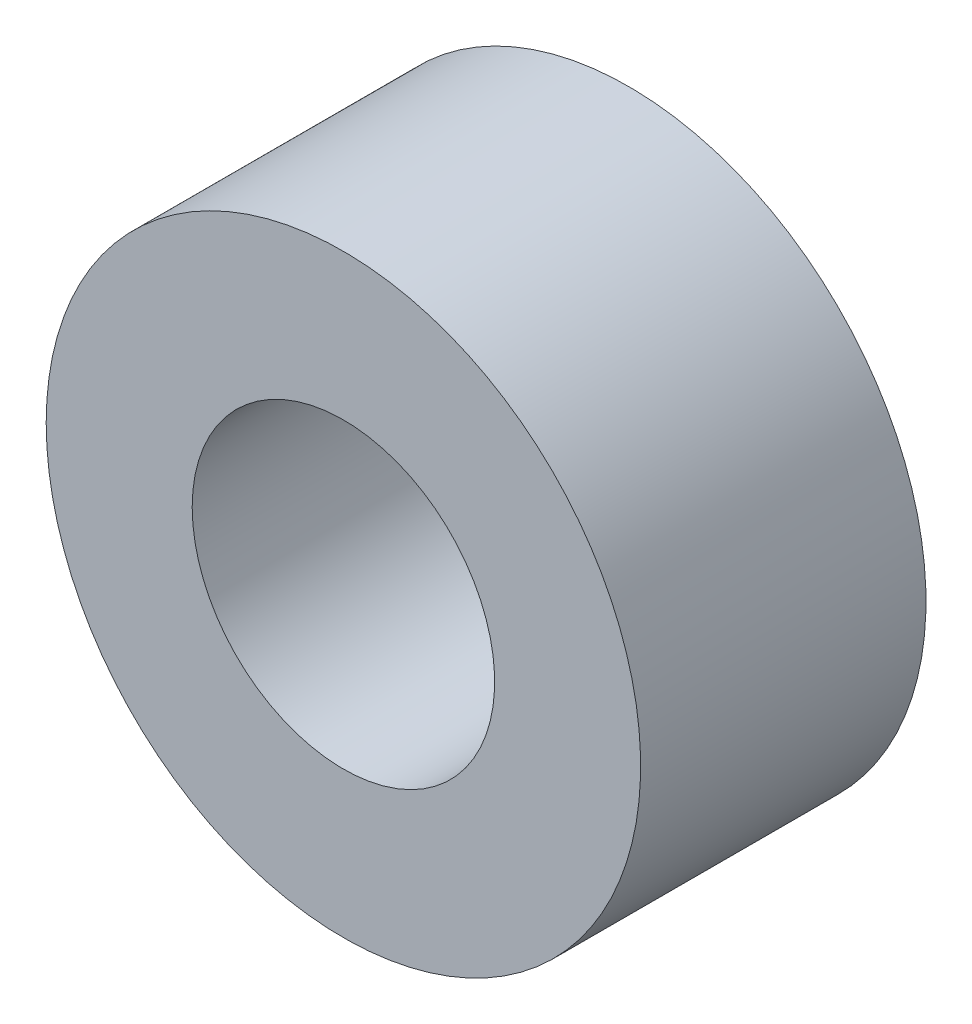
ISO-10303-21;
HEADER;
FILE_DESCRIPTION(('STEP AP214'),'2;1');
FILE_NAME('part.step','',(''),(''),'','','');
FILE_SCHEMA(('AUTOMOTIVE_DESIGN { 1 0 10303 214 1 1 1 1 }'));
ENDSEC;
DATA;
#1=APPLICATION_CONTEXT('core data for automotive mechanical design processes');
#2=APPLICATION_PROTOCOL_DEFINITION('international standard','automotive_design',2000,#1);
#3=PRODUCT_CONTEXT('',#1,'mechanical');
#4=PRODUCT('Part','Part','',(#3));
#5=PRODUCT_RELATED_PRODUCT_CATEGORY('part','',(#4));
#6=PRODUCT_DEFINITION_FORMATION('','',#4);
#7=PRODUCT_DEFINITION_CONTEXT('part definition',#1,'design');
#8=PRODUCT_DEFINITION('design','',#6,#7);
#9=PRODUCT_DEFINITION_SHAPE('','',#8);
#10=(LENGTH_UNIT() NAMED_UNIT(*) SI_UNIT(.MILLI.,.METRE.));
#11=(NAMED_UNIT(*) PLANE_ANGLE_UNIT() SI_UNIT($,.RADIAN.));
#12=(NAMED_UNIT(*) SI_UNIT($,.STERADIAN.) SOLID_ANGLE_UNIT());
#13=UNCERTAINTY_MEASURE_WITH_UNIT(LENGTH_MEASURE(1.E-05),#10,'distance_accuracy_value','');
#14=(GEOMETRIC_REPRESENTATION_CONTEXT(3) GLOBAL_UNCERTAINTY_ASSIGNED_CONTEXT((#13)) GLOBAL_UNIT_ASSIGNED_CONTEXT((#10,
#11,#12)) REPRESENTATION_CONTEXT('',''));
#15=CARTESIAN_POINT('',(0.,0.,0.));
#16=DIRECTION('',(0.,0.,1.));
#17=DIRECTION('',(1.,0.,0.));
#18=AXIS2_PLACEMENT_3D('',#15,#16,#17);
#19=CARTESIAN_POINT('',(0.,0.,7.62));
#20=DIRECTION('',(0.,0.,1.));
#21=DIRECTION('',(1.,0.,0.));
#22=AXIS2_PLACEMENT_3D('',#19,#20,#21);
#23=PLANE('',#22);
#24=CARTESIAN_POINT('',(0.,0.,7.62));
#25=DIRECTION('',(0.,0.,1.));
#26=DIRECTION('',(1.,0.,0.));
#27=AXIS2_PLACEMENT_3D('',#24,#25,#26);
#28=CIRCLE('',#27,7.9375);
#29=CARTESIAN_POINT('',(-7.9375,0.,7.62));
#30=VERTEX_POINT('',#29);
#31=EDGE_CURVE('E10',#30,#30,#28,.T.);
#32=ORIENTED_EDGE('',*,*,#31,.T.);
#33=EDGE_LOOP('',(#32));
#34=FACE_BOUND('',#33,.T.);
#35=CARTESIAN_POINT('',(0.,0.,7.62));
#36=DIRECTION('',(0.,0.,1.));
#37=DIRECTION('',(1.,0.,0.));
#38=AXIS2_PLACEMENT_3D('',#35,#36,#37);
#39=CIRCLE('',#38,4.0386);
#40=CARTESIAN_POINT('',(-4.0386,0.,7.62));
#41=VERTEX_POINT('',#40);
#42=EDGE_CURVE('E42',#41,#41,#39,.T.);
#43=ORIENTED_EDGE('',*,*,#42,.F.);
#44=EDGE_LOOP('',(#43));
#45=FACE_BOUND('',#44,.T.);
#46=ADVANCED_FACE('F31',(#34,#45),#23,.T.);
#47=CARTESIAN_POINT('',(0.,0.,0.));
#48=DIRECTION('',(0.,0.,1.));
#49=DIRECTION('',(1.,0.,0.));
#50=AXIS2_PLACEMENT_3D('',#47,#48,#49);
#51=PLANE('',#50);
#52=CARTESIAN_POINT('',(0.,0.,0.));
#53=DIRECTION('',(0.,0.,1.));
#54=DIRECTION('',(1.,0.,0.));
#55=AXIS2_PLACEMENT_3D('',#52,#53,#54);
#56=CIRCLE('',#55,7.9375);
#57=CARTESIAN_POINT('',(-7.9375,0.,0.));
#58=VERTEX_POINT('',#57);
#59=EDGE_CURVE('E35',#58,#58,#56,.T.);
#60=ORIENTED_EDGE('',*,*,#59,.F.);
#61=EDGE_LOOP('',(#60));
#62=FACE_BOUND('',#61,.T.);
#63=CARTESIAN_POINT('',(0.,0.,0.));
#64=DIRECTION('',(0.,0.,1.));
#65=DIRECTION('',(1.,0.,0.));
#66=AXIS2_PLACEMENT_3D('',#63,#64,#65);
#67=CIRCLE('',#66,4.0386);
#68=CARTESIAN_POINT('',(-4.0386,0.,0.));
#69=VERTEX_POINT('',#68);
#70=EDGE_CURVE('E44',#69,#69,#67,.T.);
#71=ORIENTED_EDGE('',*,*,#70,.T.);
#72=EDGE_LOOP('',(#71));
#73=FACE_BOUND('',#72,.T.);
#74=ADVANCED_FACE('F54',(#62,#73),#51,.F.);
#75=CARTESIAN_POINT('',(0.,0.,7.62));
#76=DIRECTION('',(0.,0.,-1.));
#77=DIRECTION('',(-1.,0.,0.));
#78=AXIS2_PLACEMENT_3D('',#75,#76,#77);
#79=CYLINDRICAL_SURFACE('',#78,7.9375);
#80=CARTESIAN_POINT('',(-7.9375,0.,7.62));
#81=CARTESIAN_POINT('',(-7.9375,0.,7.540625));
#82=CARTESIAN_POINT('',(-7.9375,0.,7.46125));
#83=CARTESIAN_POINT('',(-7.9375,0.,7.3025));
#84=CARTESIAN_POINT('',(-7.9375,0.,7.223125));
#85=CARTESIAN_POINT('',(-7.9375,0.,7.064375));
#86=CARTESIAN_POINT('',(-7.9375,0.,6.985));
#87=CARTESIAN_POINT('',(-7.9375,0.,6.82625));
#88=CARTESIAN_POINT('',(-7.9375,0.,6.746875));
#89=CARTESIAN_POINT('',(-7.9375,0.,6.588125));
#90=CARTESIAN_POINT('',(-7.9375,0.,6.50875));
#91=CARTESIAN_POINT('',(-7.9375,0.,6.35));
#92=CARTESIAN_POINT('',(-7.9375,0.,6.270625));
#93=CARTESIAN_POINT('',(-7.9375,0.,6.111875));
#94=CARTESIAN_POINT('',(-7.9375,0.,6.0325));
#95=CARTESIAN_POINT('',(-7.9375,0.,5.87375));
#96=CARTESIAN_POINT('',(-7.9375,0.,5.794375));
#97=CARTESIAN_POINT('',(-7.9375,0.,5.635625));
#98=CARTESIAN_POINT('',(-7.9375,0.,5.55625));
#99=CARTESIAN_POINT('',(-7.9375,0.,5.3975));
#100=CARTESIAN_POINT('',(-7.9375,0.,5.318125));
#101=CARTESIAN_POINT('',(-7.9375,0.,5.159375));
#102=CARTESIAN_POINT('',(-7.9375,0.,5.08));
#103=CARTESIAN_POINT('',(-7.9375,0.,4.92125));
#104=CARTESIAN_POINT('',(-7.9375,0.,4.841875));
#105=CARTESIAN_POINT('',(-7.9375,0.,4.683125));
#106=CARTESIAN_POINT('',(-7.9375,0.,4.60375));
#107=CARTESIAN_POINT('',(-7.9375,0.,4.445));
#108=CARTESIAN_POINT('',(-7.9375,0.,4.365625));
#109=CARTESIAN_POINT('',(-7.9375,0.,4.206875));
#110=CARTESIAN_POINT('',(-7.9375,0.,4.1275));
#111=CARTESIAN_POINT('',(-7.9375,0.,3.96875));
#112=CARTESIAN_POINT('',(-7.9375,0.,3.889375));
#113=CARTESIAN_POINT('',(-7.9375,0.,3.730625));
#114=CARTESIAN_POINT('',(-7.9375,0.,3.65125));
#115=CARTESIAN_POINT('',(-7.9375,0.,3.4925));
#116=CARTESIAN_POINT('',(-7.9375,0.,3.413125));
#117=CARTESIAN_POINT('',(-7.9375,0.,3.254375));
#118=CARTESIAN_POINT('',(-7.9375,0.,3.175));
#119=CARTESIAN_POINT('',(-7.9375,0.,3.01625));
#120=CARTESIAN_POINT('',(-7.9375,0.,2.936875));
#121=CARTESIAN_POINT('',(-7.9375,0.,2.778125));
#122=CARTESIAN_POINT('',(-7.9375,0.,2.69875));
#123=CARTESIAN_POINT('',(-7.9375,0.,2.54));
#124=CARTESIAN_POINT('',(-7.9375,0.,2.460625));
#125=CARTESIAN_POINT('',(-7.9375,0.,2.301875));
#126=CARTESIAN_POINT('',(-7.9375,0.,2.2225));
#127=CARTESIAN_POINT('',(-7.9375,0.,2.06375));
#128=CARTESIAN_POINT('',(-7.9375,0.,1.984375));
#129=CARTESIAN_POINT('',(-7.9375,0.,1.825625));
#130=CARTESIAN_POINT('',(-7.9375,0.,1.74625));
#131=CARTESIAN_POINT('',(-7.9375,0.,1.5875));
#132=CARTESIAN_POINT('',(-7.9375,0.,1.508125));
#133=CARTESIAN_POINT('',(-7.9375,0.,1.349375));
#134=CARTESIAN_POINT('',(-7.9375,0.,1.27));
#135=CARTESIAN_POINT('',(-7.9375,0.,1.11125));
#136=CARTESIAN_POINT('',(-7.9375,0.,1.031875));
#137=CARTESIAN_POINT('',(-7.9375,0.,0.873125));
#138=CARTESIAN_POINT('',(-7.9375,0.,0.79375));
#139=CARTESIAN_POINT('',(-7.9375,0.,0.635));
#140=CARTESIAN_POINT('',(-7.9375,0.,0.555625));
#141=CARTESIAN_POINT('',(-7.9375,0.,0.396875));
#142=CARTESIAN_POINT('',(-7.9375,0.,0.3175));
#143=CARTESIAN_POINT('',(-7.9375,0.,0.15875));
#144=CARTESIAN_POINT('',(-7.9375,0.,0.0793749999999999));
#145=CARTESIAN_POINT('',(-7.9375,0.,0.));
#146=B_SPLINE_CURVE_WITH_KNOTS('',3,(#80,#81,#82,#83,#84,#85,#86,#87,#88,#89,#90,#91,#92,#93,
#94,#95,#96,#97,#98,#99,#100,#101,#102,#103,#104,#105,#106,#107,#108,#109,#110,#111,#112,#113,
#114,#115,#116,#117,#118,#119,#120,#121,#122,#123,#124,#125,#126,#127,#128,#129,#130,#131,#132,
#133,#134,#135,#136,#137,#138,#139,#140,#141,#142,#143,#144,#145),.UNSPECIFIED.,.F.,.F.,(4,2,2,
2,2,2,2,2,2,2,2,2,2,2,2,2,2,2,2,2,2,2,2,2,2,2,2,2,2,2,2,2,4),(0.,0.238125,0.476249999999999,
0.714375,0.952499999999999,1.190625,1.42875,1.666875,1.905,2.143125,2.38125,2.619375,2.8575,
3.095625,3.33375,3.571875,3.81,4.048125,4.28625,4.524375,4.7625,5.000625,5.23875,5.476875,5.715,
5.953125,6.19125,6.429375,6.6675,6.905625,7.14375,7.381875,7.62),.UNSPECIFIED.);
#147=EDGE_CURVE('BSEAM33',#30,#58,#146,.T.);
#148=ORIENTED_EDGE('',*,*,#31,.F.);
#149=ORIENTED_EDGE('',*,*,#59,.T.);
#150=ORIENTED_EDGE('',*,*,#147,.T.);
#151=ORIENTED_EDGE('',*,*,#147,.F.);
#152=EDGE_LOOP('',(#148,#150,#149,#151));
#153=FACE_BOUND('',#152,.T.);
#154=ADVANCED_FACE('F33',(#153),#79,.T.);
#155=CARTESIAN_POINT('',(0.,0.,7.62));
#156=DIRECTION('',(0.,0.,-1.));
#157=DIRECTION('',(-1.,0.,0.));
#158=AXIS2_PLACEMENT_3D('',#155,#156,#157);
#159=CYLINDRICAL_SURFACE('',#158,4.0386);
#160=CARTESIAN_POINT('',(-4.0386,0.,7.62));
#161=CARTESIAN_POINT('',(-4.0386,0.,7.540625));
#162=CARTESIAN_POINT('',(-4.0386,0.,7.46125));
#163=CARTESIAN_POINT('',(-4.0386,0.,7.3025));
#164=CARTESIAN_POINT('',(-4.0386,0.,7.223125));
#165=CARTESIAN_POINT('',(-4.0386,0.,7.064375));
#166=CARTESIAN_POINT('',(-4.0386,0.,6.985));
#167=CARTESIAN_POINT('',(-4.0386,0.,6.82625));
#168=CARTESIAN_POINT('',(-4.0386,0.,6.746875));
#169=CARTESIAN_POINT('',(-4.0386,0.,6.588125));
#170=CARTESIAN_POINT('',(-4.0386,0.,6.50875));
#171=CARTESIAN_POINT('',(-4.0386,0.,6.35));
#172=CARTESIAN_POINT('',(-4.0386,0.,6.270625));
#173=CARTESIAN_POINT('',(-4.0386,0.,6.111875));
#174=CARTESIAN_POINT('',(-4.0386,0.,6.0325));
#175=CARTESIAN_POINT('',(-4.0386,0.,5.87375));
#176=CARTESIAN_POINT('',(-4.0386,0.,5.794375));
#177=CARTESIAN_POINT('',(-4.0386,0.,5.635625));
#178=CARTESIAN_POINT('',(-4.0386,0.,5.55625));
#179=CARTESIAN_POINT('',(-4.0386,0.,5.3975));
#180=CARTESIAN_POINT('',(-4.0386,0.,5.318125));
#181=CARTESIAN_POINT('',(-4.0386,0.,5.159375));
#182=CARTESIAN_POINT('',(-4.0386,0.,5.08));
#183=CARTESIAN_POINT('',(-4.0386,0.,4.92125));
#184=CARTESIAN_POINT('',(-4.0386,0.,4.841875));
#185=CARTESIAN_POINT('',(-4.0386,0.,4.683125));
#186=CARTESIAN_POINT('',(-4.0386,0.,4.60375));
#187=CARTESIAN_POINT('',(-4.0386,0.,4.445));
#188=CARTESIAN_POINT('',(-4.0386,0.,4.365625));
#189=CARTESIAN_POINT('',(-4.0386,0.,4.206875));
#190=CARTESIAN_POINT('',(-4.0386,0.,4.1275));
#191=CARTESIAN_POINT('',(-4.0386,0.,3.96875));
#192=CARTESIAN_POINT('',(-4.0386,0.,3.889375));
#193=CARTESIAN_POINT('',(-4.0386,0.,3.730625));
#194=CARTESIAN_POINT('',(-4.0386,0.,3.65125));
#195=CARTESIAN_POINT('',(-4.0386,0.,3.4925));
#196=CARTESIAN_POINT('',(-4.0386,0.,3.413125));
#197=CARTESIAN_POINT('',(-4.0386,0.,3.254375));
#198=CARTESIAN_POINT('',(-4.0386,0.,3.175));
#199=CARTESIAN_POINT('',(-4.0386,0.,3.01625));
#200=CARTESIAN_POINT('',(-4.0386,0.,2.936875));
#201=CARTESIAN_POINT('',(-4.0386,0.,2.778125));
#202=CARTESIAN_POINT('',(-4.0386,0.,2.69875));
#203=CARTESIAN_POINT('',(-4.0386,0.,2.54));
#204=CARTESIAN_POINT('',(-4.0386,0.,2.460625));
#205=CARTESIAN_POINT('',(-4.0386,0.,2.301875));
#206=CARTESIAN_POINT('',(-4.0386,0.,2.2225));
#207=CARTESIAN_POINT('',(-4.0386,0.,2.06375));
#208=CARTESIAN_POINT('',(-4.0386,0.,1.984375));
#209=CARTESIAN_POINT('',(-4.0386,0.,1.825625));
#210=CARTESIAN_POINT('',(-4.0386,0.,1.74625));
#211=CARTESIAN_POINT('',(-4.0386,0.,1.5875));
#212=CARTESIAN_POINT('',(-4.0386,0.,1.508125));
#213=CARTESIAN_POINT('',(-4.0386,0.,1.349375));
#214=CARTESIAN_POINT('',(-4.0386,0.,1.27));
#215=CARTESIAN_POINT('',(-4.0386,0.,1.11125));
#216=CARTESIAN_POINT('',(-4.0386,0.,1.031875));
#217=CARTESIAN_POINT('',(-4.0386,0.,0.873125));
#218=CARTESIAN_POINT('',(-4.0386,0.,0.79375));
#219=CARTESIAN_POINT('',(-4.0386,0.,0.635));
#220=CARTESIAN_POINT('',(-4.0386,0.,0.555625));
#221=CARTESIAN_POINT('',(-4.0386,0.,0.396875));
#222=CARTESIAN_POINT('',(-4.0386,0.,0.3175));
#223=CARTESIAN_POINT('',(-4.0386,0.,0.15875));
#224=CARTESIAN_POINT('',(-4.0386,0.,0.0793749999999999));
#225=CARTESIAN_POINT('',(-4.0386,0.,0.));
#226=B_SPLINE_CURVE_WITH_KNOTS('',3,(#160,#161,#162,#163,#164,#165,#166,#167,#168,#169,#170,
#171,#172,#173,#174,#175,#176,#177,#178,#179,#180,#181,#182,#183,#184,#185,#186,#187,#188,#189,
#190,#191,#192,#193,#194,#195,#196,#197,#198,#199,#200,#201,#202,#203,#204,#205,#206,#207,#208,
#209,#210,#211,#212,#213,#214,#215,#216,#217,#218,#219,#220,#221,#222,#223,#224,#225),
.UNSPECIFIED.,.F.,.F.,(4,2,2,2,2,2,2,2,2,2,2,2,2,2,2,2,2,2,2,2,2,2,2,2,2,2,2,2,2,2,2,2,4),(0.,
0.238125,0.47625,0.714375000000001,0.9525,1.190625,1.42875,1.666875,1.905,2.143125,2.38125,
2.619375,2.8575,3.095625,3.33375,3.571875,3.81,4.048125,4.28625,4.524375,4.7625,5.000625,
5.23875,5.476875,5.715,5.953125,6.19125,6.429375,6.6675,6.905625,7.14375,7.381875,7.62),.UNSPECIFIED.);
#227=EDGE_CURVE('BSEAM50',#41,#69,#226,.T.);
#228=ORIENTED_EDGE('',*,*,#42,.T.);
#229=ORIENTED_EDGE('',*,*,#70,.F.);
#230=ORIENTED_EDGE('',*,*,#227,.T.);
#231=ORIENTED_EDGE('',*,*,#227,.F.);
#232=EDGE_LOOP('',(#228,#230,#229,#231));
#233=FACE_BOUND('',#232,.T.);
#234=ADVANCED_FACE('F50',(#233),#159,.F.);
#235=CLOSED_SHELL('',(#46,#74,#154,#234));
#236=MANIFOLD_SOLID_BREP('B2',#235);
#237=ADVANCED_BREP_SHAPE_REPRESENTATION('',(#18,#236),#14);
#238=SHAPE_DEFINITION_REPRESENTATION(#9,#237);
ENDSEC;
END-ISO-10303-21;
